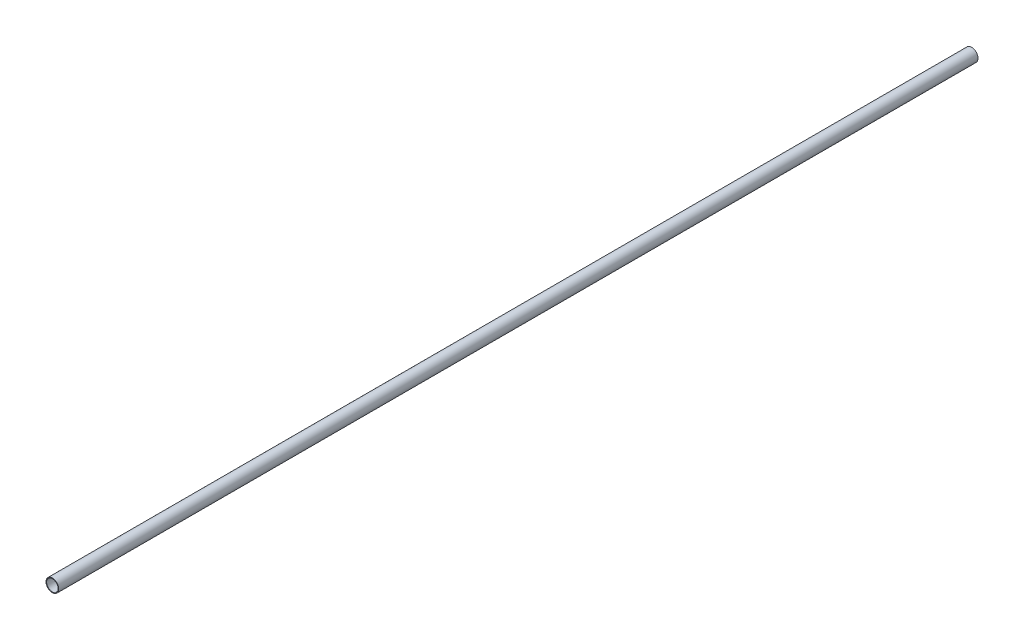
ISO-10303-21;
HEADER;
FILE_DESCRIPTION(('STEP AP214'),'2;1');
FILE_NAME('part.step','',(''),(''),'','','');
FILE_SCHEMA(('AUTOMOTIVE_DESIGN { 1 0 10303 214 1 1 1 1 }'));
ENDSEC;
DATA;
#1=APPLICATION_CONTEXT('core data for automotive mechanical design processes');
#2=APPLICATION_PROTOCOL_DEFINITION('international standard','automotive_design',2000,#1);
#3=PRODUCT_CONTEXT('',#1,'mechanical');
#4=PRODUCT('Part','Part','',(#3));
#5=PRODUCT_RELATED_PRODUCT_CATEGORY('part','',(#4));
#6=PRODUCT_DEFINITION_FORMATION('','',#4);
#7=PRODUCT_DEFINITION_CONTEXT('part definition',#1,'design');
#8=PRODUCT_DEFINITION('design','',#6,#7);
#9=PRODUCT_DEFINITION_SHAPE('','',#8);
#10=(LENGTH_UNIT() NAMED_UNIT(*) SI_UNIT(.MILLI.,.METRE.));
#11=(NAMED_UNIT(*) PLANE_ANGLE_UNIT() SI_UNIT($,.RADIAN.));
#12=(NAMED_UNIT(*) SI_UNIT($,.STERADIAN.) SOLID_ANGLE_UNIT());
#13=UNCERTAINTY_MEASURE_WITH_UNIT(LENGTH_MEASURE(1.E-05),#10,'distance_accuracy_value','');
#14=(GEOMETRIC_REPRESENTATION_CONTEXT(3) GLOBAL_UNCERTAINTY_ASSIGNED_CONTEXT((#13)) GLOBAL_UNIT_ASSIGNED_CONTEXT((#10,
#11,#12)) REPRESENTATION_CONTEXT('',''));
#15=CARTESIAN_POINT('',(0.,0.,0.));
#16=DIRECTION('',(0.,0.,1.));
#17=DIRECTION('',(1.,0.,0.));
#18=AXIS2_PLACEMENT_3D('',#15,#16,#17);
#19=CARTESIAN_POINT('',(0.,0.,914.4));
#20=DIRECTION('',(0.,0.,1.));
#21=DIRECTION('',(1.,0.,0.));
#22=AXIS2_PLACEMENT_3D('',#19,#20,#21);
#23=PLANE('',#22);
#24=CARTESIAN_POINT('',(0.,0.,914.4));
#25=DIRECTION('',(0.,0.,1.));
#26=DIRECTION('',(1.,0.,0.));
#27=AXIS2_PLACEMENT_3D('',#24,#25,#26);
#28=CIRCLE('',#27,12.7);
#29=CARTESIAN_POINT('',(12.7,0.,914.4));
#30=VERTEX_POINT('',#29);
#31=EDGE_CURVE('E10',#30,#30,#28,.T.);
#32=ORIENTED_EDGE('',*,*,#31,.T.);
#33=EDGE_LOOP('',(#32));
#34=FACE_BOUND('',#33,.T.);
#35=CARTESIAN_POINT('',(0.,0.,914.4));
#36=DIRECTION('',(0.,0.,1.));
#37=DIRECTION('',(1.,0.,0.));
#38=AXIS2_PLACEMENT_3D('',#35,#36,#37);
#39=CIRCLE('',#38,11.4554);
#40=CARTESIAN_POINT('',(11.4554,0.,914.4));
#41=VERTEX_POINT('',#40);
#42=EDGE_CURVE('E41',#41,#41,#39,.T.);
#43=ORIENTED_EDGE('',*,*,#42,.F.);
#44=EDGE_LOOP('',(#43));
#45=FACE_BOUND('',#44,.T.);
#46=ADVANCED_FACE('F30',(#34,#45),#23,.T.);
#47=CARTESIAN_POINT('',(0.,0.,-914.4));
#48=DIRECTION('',(0.,0.,1.));
#49=DIRECTION('',(1.,0.,0.));
#50=AXIS2_PLACEMENT_3D('',#47,#48,#49);
#51=PLANE('',#50);
#52=CARTESIAN_POINT('',(0.,0.,-914.4));
#53=DIRECTION('',(0.,0.,1.));
#54=DIRECTION('',(1.,0.,0.));
#55=AXIS2_PLACEMENT_3D('',#52,#53,#54);
#56=CIRCLE('',#55,12.7);
#57=CARTESIAN_POINT('',(12.7,0.,-914.4));
#58=VERTEX_POINT('',#57);
#59=EDGE_CURVE('E34',#58,#58,#56,.T.);
#60=ORIENTED_EDGE('',*,*,#59,.F.);
#61=EDGE_LOOP('',(#60));
#62=FACE_BOUND('',#61,.T.);
#63=CARTESIAN_POINT('',(0.,0.,-914.4));
#64=DIRECTION('',(0.,0.,1.));
#65=DIRECTION('',(1.,0.,0.));
#66=AXIS2_PLACEMENT_3D('',#63,#64,#65);
#67=CIRCLE('',#66,11.4554);
#68=CARTESIAN_POINT('',(11.4554,0.,-914.4));
#69=VERTEX_POINT('',#68);
#70=EDGE_CURVE('E43',#69,#69,#67,.T.);
#71=ORIENTED_EDGE('',*,*,#70,.T.);
#72=EDGE_LOOP('',(#71));
#73=FACE_BOUND('',#72,.T.);
#74=ADVANCED_FACE('F53',(#62,#73),#51,.F.);
#75=CARTESIAN_POINT('',(0.,0.,914.4));
#76=DIRECTION('',(0.,0.,-1.));
#77=DIRECTION('',(-1.,0.,0.));
#78=AXIS2_PLACEMENT_3D('',#75,#76,#77);
#79=CYLINDRICAL_SURFACE('',#78,12.7);
#80=ORIENTED_EDGE('',*,*,#31,.F.);
#81=EDGE_LOOP('',(#80));
#82=FACE_BOUND('',#81,.T.);
#83=ORIENTED_EDGE('',*,*,#59,.T.);
#84=EDGE_LOOP('',(#83));
#85=FACE_BOUND('',#84,.T.);
#86=ADVANCED_FACE('F32',(#82,#85),#79,.T.);
#87=CARTESIAN_POINT('',(0.,0.,914.4));
#88=DIRECTION('',(0.,0.,-1.));
#89=DIRECTION('',(-1.,0.,0.));
#90=AXIS2_PLACEMENT_3D('',#87,#88,#89);
#91=CYLINDRICAL_SURFACE('',#90,11.4554);
#92=ORIENTED_EDGE('',*,*,#42,.T.);
#93=EDGE_LOOP('',(#92));
#94=FACE_BOUND('',#93,.T.);
#95=ORIENTED_EDGE('',*,*,#70,.F.);
#96=EDGE_LOOP('',(#95));
#97=FACE_BOUND('',#96,.T.);
#98=ADVANCED_FACE('F49',(#94,#97),#91,.F.);
#99=CLOSED_SHELL('',(#46,#74,#86,#98));
#100=MANIFOLD_SOLID_BREP('B2',#99);
#101=ADVANCED_BREP_SHAPE_REPRESENTATION('',(#18,#100),#14);
#102=SHAPE_DEFINITION_REPRESENTATION(#9,#101);
ENDSEC;
END-ISO-10303-21;
